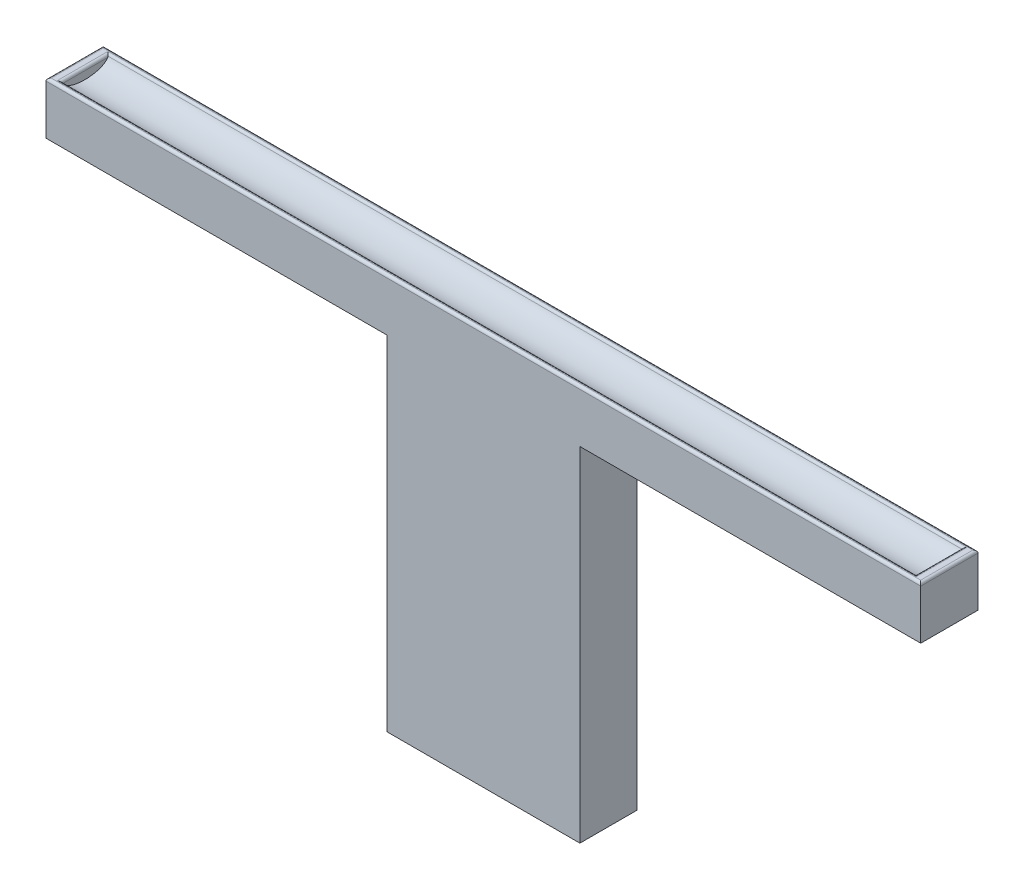
ISO-10303-21;
HEADER;
FILE_DESCRIPTION(('STEP AP214'),'2;1');
FILE_NAME('part.step','',(''),(''),'','','');
FILE_SCHEMA(('AUTOMOTIVE_DESIGN { 1 0 10303 214 1 1 1 1 }'));
ENDSEC;
DATA;
#1=APPLICATION_CONTEXT('core data for automotive mechanical design processes');
#2=APPLICATION_PROTOCOL_DEFINITION('international standard','automotive_design',2000,#1);
#3=PRODUCT_CONTEXT('',#1,'mechanical');
#4=PRODUCT('Part','Part','',(#3));
#5=PRODUCT_RELATED_PRODUCT_CATEGORY('part','',(#4));
#6=PRODUCT_DEFINITION_FORMATION('','',#4);
#7=PRODUCT_DEFINITION_CONTEXT('part definition',#1,'design');
#8=PRODUCT_DEFINITION('design','',#6,#7);
#9=PRODUCT_DEFINITION_SHAPE('','',#8);
#10=(LENGTH_UNIT() NAMED_UNIT(*) SI_UNIT(.MILLI.,.METRE.));
#11=(NAMED_UNIT(*) PLANE_ANGLE_UNIT() SI_UNIT($,.RADIAN.));
#12=(NAMED_UNIT(*) SI_UNIT($,.STERADIAN.) SOLID_ANGLE_UNIT());
#13=UNCERTAINTY_MEASURE_WITH_UNIT(LENGTH_MEASURE(1.E-05),#10,'distance_accuracy_value','');
#14=(GEOMETRIC_REPRESENTATION_CONTEXT(3) GLOBAL_UNCERTAINTY_ASSIGNED_CONTEXT((#13)) GLOBAL_UNIT_ASSIGNED_CONTEXT((#10,
#11,#12)) REPRESENTATION_CONTEXT('',''));
#15=CARTESIAN_POINT('',(0.,0.,0.));
#16=DIRECTION('',(0.,0.,1.));
#17=DIRECTION('',(1.,0.,0.));
#18=AXIS2_PLACEMENT_3D('',#15,#16,#17);
#19=CARTESIAN_POINT('',(79.7,39.5,-23.4991651044926));
#20=DIRECTION('',(-1.,0.,0.));
#21=DIRECTION('',(0.,0.,1.));
#22=AXIS2_PLACEMENT_3D('',#19,#20,#21);
#23=CYLINDRICAL_SURFACE('',#22,0.5);
#24=CARTESIAN_POINT('',(-42.370698613628,39.4999999999998,-23.4991651044926));
#25=DIRECTION('',(-0.707106781186547,0.,0.707106781186548));
#26=DIRECTION('',(-0.707106781186548,0.,-0.707106781186547));
#27=AXIS2_PLACEMENT_3D('',#24,#25,#26);
#28=ELLIPSE('',#27,0.707106781186547,0.5);
#29=CARTESIAN_POINT('',(-41.9020049228756,39.6741442627503,-23.0304714137402));
#30=VERTEX_POINT('',#29);
#31=CARTESIAN_POINT('',(-42.370698613628,39.9999999999999,-23.4991651044926));
#32=VERTEX_POINT('',#31);
#33=EDGE_CURVE('E288',#30,#32,#28,.T.);
#34=ORIENTED_EDGE('',*,*,#33,.F.);
#35=DIRECTION('',(-1.,0.,0.));
#36=VECTOR('',#35,1.);
#37=CARTESIAN_POINT('',(122.169301386372,39.6741442627503,-23.0304714137402));
#38=LINE('',#37,#36);
#39=CARTESIAN_POINT('',(122.20060769562,39.6741442627503,-23.0304714137402));
#40=VERTEX_POINT('',#39);
#41=EDGE_CURVE('E317',#40,#30,#38,.T.);
#42=ORIENTED_EDGE('',*,*,#41,.F.);
#43=CARTESIAN_POINT('',(122.669301386372,39.4999999999999,-23.4991651044926));
#44=DIRECTION('',(-0.707106781186548,0.,-0.707106781186547));
#45=DIRECTION('',(-0.707106781186547,0.,0.707106781186548));
#46=AXIS2_PLACEMENT_3D('',#43,#44,#45);
#47=ELLIPSE('',#46,0.707106781186548,0.5);
#48=CARTESIAN_POINT('',(122.669301386372,39.9999999999999,-23.4991651044926));
#49=VERTEX_POINT('',#48);
#50=EDGE_CURVE('E283',#40,#49,#47,.T.);
#51=ORIENTED_EDGE('',*,*,#50,.T.);
#52=DIRECTION('',(1.,0.,0.));
#53=VECTOR('',#52,1.);
#54=CARTESIAN_POINT('',(113.529301386372,39.9999999999999,-23.4991651044926));
#55=LINE('',#54,#53);
#56=EDGE_CURVE('E320',#32,#49,#55,.T.);
#57=ORIENTED_EDGE('',*,*,#56,.F.);
#58=EDGE_LOOP('',(#34,#42,#51,#57));
#59=FACE_BOUND('',#58,.T.);
#60=ADVANCED_FACE('F149',(#59),#23,.T.);
#61=CARTESIAN_POINT('',(79.7,39.5,-13.6820358754082));
#62=DIRECTION('',(-1.,0.,0.));
#63=DIRECTION('',(0.,0.,1.));
#64=AXIS2_PLACEMENT_3D('',#61,#62,#63);
#65=CYLINDRICAL_SURFACE('',#64,0.5);
#66=CARTESIAN_POINT('',(-42.370698613628,39.4999999999999,-13.6820358754082));
#67=DIRECTION('',(-0.707106781186548,0.,-0.707106781186547));
#68=DIRECTION('',(0.707106781186547,0.,-0.707106781186548));
#69=AXIS2_PLACEMENT_3D('',#66,#67,#68);
#70=ELLIPSE('',#69,0.707106781186547,0.5);
#71=CARTESIAN_POINT('',(-42.370698613628,39.9999999999999,-13.6820358754082));
#72=VERTEX_POINT('',#71);
#73=CARTESIAN_POINT('',(-41.9020049228756,39.6741442627503,-14.1507295661606));
#74=VERTEX_POINT('',#73);
#75=EDGE_CURVE('E291',#72,#74,#70,.T.);
#76=ORIENTED_EDGE('',*,*,#75,.F.);
#77=DIRECTION('',(-1.,0.,0.));
#78=VECTOR('',#77,1.);
#79=CARTESIAN_POINT('',(-33.230698613628,39.9999999999999,-13.6820358754082));
#80=LINE('',#79,#78);
#81=CARTESIAN_POINT('',(122.669301386372,39.9999999999999,-13.6820358754082));
#82=VERTEX_POINT('',#81);
#83=EDGE_CURVE('E380',#82,#72,#80,.T.);
#84=ORIENTED_EDGE('',*,*,#83,.F.);
#85=CARTESIAN_POINT('',(122.669301386372,39.4999999999999,-13.6820358754082));
#86=DIRECTION('',(-0.707106781186547,0.,0.707106781186548));
#87=DIRECTION('',(-0.707106781186548,0.,-0.707106781186547));
#88=AXIS2_PLACEMENT_3D('',#85,#86,#87);
#89=ELLIPSE('',#88,0.707106781186547,0.5);
#90=CARTESIAN_POINT('',(122.20060769562,39.6741442627504,-14.1507295661606));
#91=VERTEX_POINT('',#90);
#92=EDGE_CURVE('E272',#82,#91,#89,.T.);
#93=ORIENTED_EDGE('',*,*,#92,.T.);
#94=DIRECTION('',(1.,0.,0.));
#95=VECTOR('',#94,1.);
#96=CARTESIAN_POINT('',(-41.870698613628,39.6741442627503,-14.1507295661606));
#97=LINE('',#96,#95);
#98=EDGE_CURVE('E771',#74,#91,#97,.T.);
#99=ORIENTED_EDGE('',*,*,#98,.F.);
#100=EDGE_LOOP('',(#76,#84,#93,#99));
#101=FACE_BOUND('',#100,.T.);
#102=ADVANCED_FACE('F529',(#101),#65,.T.);
#103=CARTESIAN_POINT('',(0.,39.5,-23.5906004899504));
#104=DIRECTION('',(1.,0.,0.));
#105=DIRECTION('',(0.,0.,-1.));
#106=AXIS2_PLACEMENT_3D('',#103,#104,#105);
#107=CYLINDRICAL_SURFACE('',#106,0.5);
#108=CARTESIAN_POINT('',(-43.370698613628,39.4999999999999,-23.5906004899504));
#109=DIRECTION('',(0.707106781186547,0.,-0.707106781186548));
#110=DIRECTION('',(-0.707106781186548,0.,-0.707106781186547));
#111=AXIS2_PLACEMENT_3D('',#108,#109,#110);
#112=ELLIPSE('',#111,0.707106781186548,0.5);
#113=CARTESIAN_POINT('',(-43.870698613628,39.4999999999999,-24.0906004899504));
#114=VERTEX_POINT('',#113);
#115=CARTESIAN_POINT('',(-43.370698613628,39.9999999999999,-23.5906004899504));
#116=VERTEX_POINT('',#115);
#117=EDGE_CURVE('E275',#114,#116,#112,.T.);
#118=ORIENTED_EDGE('',*,*,#117,.T.);
#119=DIRECTION('',(-1.,0.,0.));
#120=VECTOR('',#119,1.);
#121=CARTESIAN_POINT('',(-35.230698613628,39.9999999999999,-23.5906004899504));
#122=LINE('',#121,#120);
#123=CARTESIAN_POINT('',(123.669301386372,39.9999999999999,-23.5906004899504));
#124=VERTEX_POINT('',#123);
#125=EDGE_CURVE('E379',#124,#116,#122,.T.);
#126=ORIENTED_EDGE('',*,*,#125,.F.);
#127=CARTESIAN_POINT('',(123.669301386372,39.4999999999999,-23.5906004899504));
#128=DIRECTION('',(-0.707106781186547,0.,-0.707106781186547));
#129=DIRECTION('',(-0.707106781186547,0.,0.707106781186547));
#130=AXIS2_PLACEMENT_3D('',#127,#128,#129);
#131=ELLIPSE('',#130,0.707106781186547,0.5);
#132=CARTESIAN_POINT('',(124.169301386372,39.4999999999999,-24.0906004899504));
#133=VERTEX_POINT('',#132);
#134=EDGE_CURVE('E267',#124,#133,#131,.T.);
#135=ORIENTED_EDGE('',*,*,#134,.T.);
#136=DIRECTION('',(1.,0.,0.));
#137=VECTOR('',#136,1.);
#138=CARTESIAN_POINT('',(115.529301386372,39.4999999999999,-24.0906004899504));
#139=LINE('',#138,#137);
#140=EDGE_CURVE('E396',#114,#133,#139,.T.);
#141=ORIENTED_EDGE('',*,*,#140,.F.);
#142=EDGE_LOOP('',(#118,#126,#135,#141));
#143=FACE_BOUND('',#142,.T.);
#144=ADVANCED_FACE('F534',(#143),#107,.T.);
#145=CARTESIAN_POINT('',(0.,39.5,-13.5906004899504));
#146=DIRECTION('',(-1.,0.,0.));
#147=DIRECTION('',(0.,0.,1.));
#148=AXIS2_PLACEMENT_3D('',#145,#146,#147);
#149=CYLINDRICAL_SURFACE('',#148,0.5);
#150=CARTESIAN_POINT('',(-43.370698613628,39.4999999999999,-13.5906004899504));
#151=DIRECTION('',(-0.707106781186548,0.,-0.707106781186547));
#152=DIRECTION('',(0.707106781186547,0.,-0.707106781186548));
#153=AXIS2_PLACEMENT_3D('',#150,#151,#152);
#154=ELLIPSE('',#153,0.707106781186547,0.5);
#155=CARTESIAN_POINT('',(-43.870698613628,39.4999999999999,-13.0906004899504));
#156=VERTEX_POINT('',#155);
#157=CARTESIAN_POINT('',(-43.370698613628,39.9999999999999,-13.5906004899504));
#158=VERTEX_POINT('',#157);
#159=EDGE_CURVE('E262',#156,#158,#154,.T.);
#160=ORIENTED_EDGE('',*,*,#159,.F.);
#161=DIRECTION('',(-1.,0.,0.));
#162=VECTOR('',#161,1.);
#163=CARTESIAN_POINT('',(-35.230698613628,39.4999999999999,-13.0906004899504));
#164=LINE('',#163,#162);
#165=CARTESIAN_POINT('',(124.169301386372,39.4999999999999,-13.0906004899504));
#166=VERTEX_POINT('',#165);
#167=EDGE_CURVE('E223',#166,#156,#164,.T.);
#168=ORIENTED_EDGE('',*,*,#167,.F.);
#169=CARTESIAN_POINT('',(123.669301386372,39.4999999999999,-13.5906004899504));
#170=DIRECTION('',(0.707106781186547,0.,-0.707106781186547));
#171=DIRECTION('',(-0.707106781186547,0.,-0.707106781186547));
#172=AXIS2_PLACEMENT_3D('',#169,#170,#171);
#173=ELLIPSE('',#172,0.707106781186547,0.5);
#174=CARTESIAN_POINT('',(123.669301386372,39.9999999999999,-13.5906004899504));
#175=VERTEX_POINT('',#174);
#176=EDGE_CURVE('E259',#175,#166,#173,.T.);
#177=ORIENTED_EDGE('',*,*,#176,.F.);
#178=DIRECTION('',(1.,0.,0.));
#179=VECTOR('',#178,1.);
#180=CARTESIAN_POINT('',(115.529301386372,39.9999999999999,-13.5906004899504));
#181=LINE('',#180,#179);
#182=EDGE_CURVE('E278',#158,#175,#181,.T.);
#183=ORIENTED_EDGE('',*,*,#182,.F.);
#184=EDGE_LOOP('',(#160,#168,#177,#183));
#185=FACE_BOUND('',#184,.T.);
#186=ADVANCED_FACE('F506',(#185),#149,.T.);
#187=CARTESIAN_POINT('',(0.,40.,0.));
#188=DIRECTION('',(0.,1.,0.));
#189=DIRECTION('',(0.,0.,1.));
#190=AXIS2_PLACEMENT_3D('',#187,#188,#189);
#191=PLANE('',#190);
#192=ORIENTED_EDGE('',*,*,#125,.T.);
#193=DIRECTION('',(0.,0.,1.));
#194=VECTOR('',#193,1.);
#195=CARTESIAN_POINT('',(-43.370698613628,39.9999999999999,-13.0906004899504));
#196=LINE('',#195,#194);
#197=EDGE_CURVE('E373',#116,#158,#196,.T.);
#198=ORIENTED_EDGE('',*,*,#197,.T.);
#199=ORIENTED_EDGE('',*,*,#182,.T.);
#200=DIRECTION('',(0.,0.,-1.));
#201=VECTOR('',#200,1.);
#202=CARTESIAN_POINT('',(123.669301386372,39.9999999999999,-24.0906004899504));
#203=LINE('',#202,#201);
#204=EDGE_CURVE('E382',#175,#124,#203,.T.);
#205=ORIENTED_EDGE('',*,*,#204,.T.);
#206=EDGE_LOOP('',(#192,#198,#199,#205));
#207=FACE_BOUND('',#206,.T.);
#208=ORIENTED_EDGE('',*,*,#56,.T.);
#209=DIRECTION('',(0.,0.,1.));
#210=VECTOR('',#209,1.);
#211=CARTESIAN_POINT('',(122.669301386372,39.9999999999999,0.));
#212=LINE('',#211,#210);
#213=EDGE_CURVE('E371',#49,#82,#212,.T.);
#214=ORIENTED_EDGE('',*,*,#213,.T.);
#215=ORIENTED_EDGE('',*,*,#83,.T.);
#216=DIRECTION('',(0.,0.,-1.));
#217=VECTOR('',#216,1.);
#218=CARTESIAN_POINT('',(-42.370698613628,39.9999999999999,0.));
#219=LINE('',#218,#217);
#220=EDGE_CURVE('E306',#72,#32,#219,.T.);
#221=ORIENTED_EDGE('',*,*,#220,.T.);
#222=EDGE_LOOP('',(#208,#214,#215,#221));
#223=FACE_BOUND('',#222,.T.);
#224=ADVANCED_FACE('F370',(#207,#223),#191,.T.);
#225=CARTESIAN_POINT('',(124.169301386372,29.9999999999999,-9.0906004899504));
#226=DIRECTION('',(0.,1.,0.));
#227=DIRECTION('',(0.,0.,1.));
#228=AXIS2_PLACEMENT_3D('',#225,#226,#227);
#229=PLANE('',#228);
#230=DIRECTION('',(0.,0.,-1.));
#231=VECTOR('',#230,1.);
#232=CARTESIAN_POINT('',(21.6091454849036,29.9999999999999,-13.0906004899504));
#233=LINE('',#232,#231);
#234=CARTESIAN_POINT('',(21.6091454849036,29.9999999999999,-13.0906004899504));
#235=VERTEX_POINT('',#234);
#236=CARTESIAN_POINT('',(21.6091454849036,29.9999999999999,-24.0906004899504));
#237=VERTEX_POINT('',#236);
#238=EDGE_CURVE('E222',#235,#237,#233,.T.);
#239=ORIENTED_EDGE('',*,*,#238,.F.);
#240=DIRECTION('',(1.,0.,0.));
#241=VECTOR('',#240,1.);
#242=CARTESIAN_POINT('',(107.929301386372,29.9999999999998,-13.0906004899504));
#243=LINE('',#242,#241);
#244=CARTESIAN_POINT('',(-43.870698613628,29.9999999999998,-13.0906004899504));
#245=VERTEX_POINT('',#244);
#246=EDGE_CURVE('E242',#245,#235,#243,.T.);
#247=ORIENTED_EDGE('',*,*,#246,.F.);
#248=DIRECTION('',(0.,0.,-1.));
#249=VECTOR('',#248,1.);
#250=CARTESIAN_POINT('',(-43.870698613628,29.9999999999998,0.));
#251=LINE('',#250,#249);
#252=CARTESIAN_POINT('',(-43.870698613628,29.9999999999998,-24.0906004899504));
#253=VERTEX_POINT('',#252);
#254=EDGE_CURVE('E424',#245,#253,#251,.T.);
#255=ORIENTED_EDGE('',*,*,#254,.T.);
#256=DIRECTION('',(1.,0.,0.));
#257=VECTOR('',#256,1.);
#258=CARTESIAN_POINT('',(115.529301386372,29.9999999999998,-24.0906004899504));
#259=LINE('',#258,#257);
#260=EDGE_CURVE('E168',#253,#237,#259,.T.);
#261=ORIENTED_EDGE('',*,*,#260,.T.);
#262=EDGE_LOOP('',(#239,#247,#255,#261));
#263=FACE_BOUND('',#262,.T.);
#264=ADVANCED_FACE('F519',(#263),#229,.F.);
#265=CARTESIAN_POINT('',(-35.230698613628,39.9999999999999,-24.0906004899504));
#266=DIRECTION('',(0.,0.,1.));
#267=DIRECTION('',(1.,0.,0.));
#268=AXIS2_PLACEMENT_3D('',#265,#266,#267);
#269=PLANE('',#268);
#270=DIRECTION('',(0.,1.,0.));
#271=VECTOR('',#270,1.);
#272=CARTESIAN_POINT('',(21.6091454849036,-36.0000000000001,-24.0906004899504));
#273=LINE('',#272,#271);
#274=CARTESIAN_POINT('',(21.6091454849036,-36.0000000000001,-24.0906004899504));
#275=VERTEX_POINT('',#274);
#276=EDGE_CURVE('E159',#275,#237,#273,.T.);
#277=ORIENTED_EDGE('',*,*,#276,.T.);
#278=ORIENTED_EDGE('',*,*,#260,.F.);
#279=DIRECTION('',(0.,-1.,0.));
#280=VECTOR('',#279,1.);
#281=CARTESIAN_POINT('',(-43.870698613628,39.9999999999999,-24.0906004899504));
#282=LINE('',#281,#280);
#283=EDGE_CURVE('E407',#114,#253,#282,.T.);
#284=ORIENTED_EDGE('',*,*,#283,.F.);
#285=ORIENTED_EDGE('',*,*,#140,.T.);
#286=DIRECTION('',(0.,-1.,0.));
#287=VECTOR('',#286,1.);
#288=CARTESIAN_POINT('',(124.169301386372,39.9999999999999,-24.0906004899504));
#289=LINE('',#288,#287);
#290=CARTESIAN_POINT('',(124.169301386372,29.9999999999999,-24.0906004899504));
#291=VERTEX_POINT('',#290);
#292=EDGE_CURVE('E13',#133,#291,#289,.T.);
#293=ORIENTED_EDGE('',*,*,#292,.T.);
#294=DIRECTION('',(1.,0.,0.));
#295=VECTOR('',#294,1.);
#296=CARTESIAN_POINT('',(124.169301386372,29.9999999999999,-24.0906004899504));
#297=LINE('',#296,#295);
#298=CARTESIAN_POINT('',(58.6933230504978,29.9999999999999,-24.0906004899504));
#299=VERTEX_POINT('',#298);
#300=EDGE_CURVE('E425',#299,#291,#297,.T.);
#301=ORIENTED_EDGE('',*,*,#300,.F.);
#302=DIRECTION('',(0.,1.,0.));
#303=VECTOR('',#302,1.);
#304=CARTESIAN_POINT('',(58.6933230504978,-36.0000000000001,-24.0906004899504));
#305=LINE('',#304,#303);
#306=CARTESIAN_POINT('',(58.6933230504978,-36.0000000000001,-24.0906004899504));
#307=VERTEX_POINT('',#306);
#308=EDGE_CURVE('E211',#307,#299,#305,.T.);
#309=ORIENTED_EDGE('',*,*,#308,.F.);
#310=DIRECTION('',(1.,0.,0.));
#311=VECTOR('',#310,1.);
#312=CARTESIAN_POINT('',(21.6091454849036,-36.0000000000001,-24.0906004899504));
#313=LINE('',#312,#311);
#314=EDGE_CURVE('E205',#275,#307,#313,.T.);
#315=ORIENTED_EDGE('',*,*,#314,.F.);
#316=EDGE_LOOP('',(#277,#278,#284,#285,#293,#301,#309,#315));
#317=FACE_BOUND('',#316,.T.);
#318=ADVANCED_FACE('F207',(#317),#269,.F.);
#319=CARTESIAN_POINT('',(116.569301386372,39.9999999999999,-13.0906004899504));
#320=DIRECTION('',(0.,0.,-1.));
#321=DIRECTION('',(-1.,0.,0.));
#322=AXIS2_PLACEMENT_3D('',#319,#320,#321);
#323=PLANE('',#322);
#324=ORIENTED_EDGE('',*,*,#167,.T.);
#325=DIRECTION('',(0.,-1.,0.));
#326=VECTOR('',#325,1.);
#327=CARTESIAN_POINT('',(-43.870698613628,39.9999999999999,-13.0906004899504));
#328=LINE('',#327,#326);
#329=EDGE_CURVE('E393',#156,#245,#328,.T.);
#330=ORIENTED_EDGE('',*,*,#329,.T.);
#331=ORIENTED_EDGE('',*,*,#246,.T.);
#332=DIRECTION('',(0.,1.,0.));
#333=VECTOR('',#332,1.);
#334=CARTESIAN_POINT('',(21.6091454849036,-36.0000000000001,-13.0906004899504));
#335=LINE('',#334,#333);
#336=CARTESIAN_POINT('',(21.6091454849036,-36.0000000000001,-13.0906004899504));
#337=VERTEX_POINT('',#336);
#338=EDGE_CURVE('E238',#337,#235,#335,.T.);
#339=ORIENTED_EDGE('',*,*,#338,.F.);
#340=DIRECTION('',(-1.,0.,0.));
#341=VECTOR('',#340,1.);
#342=CARTESIAN_POINT('',(21.6091454849036,-36.0000000000001,-13.0906004899504));
#343=LINE('',#342,#341);
#344=CARTESIAN_POINT('',(58.6933230504978,-36.0000000000001,-13.0906004899504));
#345=VERTEX_POINT('',#344);
#346=EDGE_CURVE('E226',#345,#337,#343,.T.);
#347=ORIENTED_EDGE('',*,*,#346,.F.);
#348=DIRECTION('',(0.,1.,0.));
#349=VECTOR('',#348,1.);
#350=CARTESIAN_POINT('',(58.6933230504978,-36.0000000000001,-13.0906004899504));
#351=LINE('',#350,#349);
#352=CARTESIAN_POINT('',(58.6933230504978,29.9999999999999,-13.0906004899504));
#353=VERTEX_POINT('',#352);
#354=EDGE_CURVE('E417',#345,#353,#351,.T.);
#355=ORIENTED_EDGE('',*,*,#354,.T.);
#356=DIRECTION('',(1.,0.,0.));
#357=VECTOR('',#356,1.);
#358=CARTESIAN_POINT('',(116.569301386372,29.9999999999999,-13.0906004899504));
#359=LINE('',#358,#357);
#360=CARTESIAN_POINT('',(124.169301386372,29.9999999999999,-13.0906004899504));
#361=VERTEX_POINT('',#360);
#362=EDGE_CURVE('E414',#353,#361,#359,.T.);
#363=ORIENTED_EDGE('',*,*,#362,.T.);
#364=DIRECTION('',(0.,-1.,0.));
#365=VECTOR('',#364,1.);
#366=CARTESIAN_POINT('',(124.169301386372,39.9999999999999,-13.0906004899504));
#367=LINE('',#366,#365);
#368=EDGE_CURVE('E399',#166,#361,#367,.T.);
#369=ORIENTED_EDGE('',*,*,#368,.F.);
#370=EDGE_LOOP('',(#324,#330,#331,#339,#347,#355,#363,#369));
#371=FACE_BOUND('',#370,.T.);
#372=ADVANCED_FACE('F456',(#371),#323,.F.);
#373=CARTESIAN_POINT('',(134.018159188168,39.9999999999999,-18.5906004899504));
#374=DIRECTION('',(-1.,0.,0.));
#375=DIRECTION('',(0.,0.,1.));
#376=AXIS2_PLACEMENT_3D('',#373,#374,#375);
#377=ELLIPSE('',#376,4.5,2.);
#378=DIRECTION('',(-1.,0.,0.));
#379=VECTOR('',#378,1.);
#380=SURFACE_OF_LINEAR_EXTRUSION('',#377,#379);
#381=ORIENTED_EDGE('',*,*,#41,.T.);
#382=CARTESIAN_POINT('',(-41.9020049228756,39.6741442627503,-23.0304714137402));
#383=CARTESIAN_POINT('',(-41.898389196127,39.6644148707311,-23.0268576576833));
#384=CARTESIAN_POINT('',(-41.8951010155036,39.6546351901778,-23.0230565023231));
#385=CARTESIAN_POINT('',(-41.8891909730622,39.6351053359472,-23.01512636861));
#386=CARTESIAN_POINT('',(-41.8865640049845,39.6253555492551,-23.0110002473491));
#387=CARTESIAN_POINT('',(-41.8819389554278,39.605894848501,-23.0024249293393));
#388=CARTESIAN_POINT('',(-41.8799385772576,39.596183924401,-22.997976987807));
#389=CARTESIAN_POINT('',(-41.8765360626027,39.5768117312066,-22.9887661707618));
#390=CARTESIAN_POINT('',(-41.8751337041088,39.5671504450028,-22.9840034128813));
#391=CARTESIAN_POINT('',(-41.8729007146377,39.5478727373782,-22.9741635103287));
#392=CARTESIAN_POINT('',(-41.8720724489043,39.5382566617961,-22.9690851578717));
#393=CARTESIAN_POINT('',(-41.8709691956277,39.5190681689827,-22.9586167168078));
#394=CARTESIAN_POINT('',(-41.8706984510529,39.5094966356994,-22.9532245563896));
#395=CARTESIAN_POINT('',(-41.870698613628,39.4999999999998,-22.9477067544337));
#396=B_SPLINE_CURVE_WITH_KNOTS('',3,(#382,#383,#384,#385,#386,#387,#388,#389,#390,#391,#392,
#393,#394,#395),.UNSPECIFIED.,.F.,.F.,(4,2,2,2,2,2,4),(0.,0.032962943611274,0.0656629273291335,
0.0982416112863772,0.130808190151781,0.163508157262706,0.196456078578821),.UNSPECIFIED.);
#397=CARTESIAN_POINT('',(-41.870698613628,39.4999999999999,-22.9477067544337));
#398=VERTEX_POINT('',#397);
#399=EDGE_CURVE('E311',#30,#398,#396,.T.);
#400=ORIENTED_EDGE('',*,*,#399,.T.);
#401=CARTESIAN_POINT('',(-41.870698613628,39.9999999999999,-18.5906004899504));
#402=DIRECTION('',(1.,0.,0.));
#403=DIRECTION('',(0.,0.,1.));
#404=AXIS2_PLACEMENT_3D('',#401,#402,#403);
#405=ELLIPSE('',#404,4.5,2.);
#406=CARTESIAN_POINT('',(-41.870698613628,39.4999999999999,-14.2334942254671));
#407=VERTEX_POINT('',#406);
#408=EDGE_CURVE('E252',#407,#398,#405,.T.);
#409=ORIENTED_EDGE('',*,*,#408,.F.);
#410=CARTESIAN_POINT('',(-41.870698613628,39.4999999999999,-14.2334942254671));
#411=CARTESIAN_POINT('',(-41.8706984510529,39.5094966356994,-14.2279764235112));
#412=CARTESIAN_POINT('',(-41.8709691956277,39.5190681689827,-14.222584263093));
#413=CARTESIAN_POINT('',(-41.8720724489043,39.5382566617961,-14.2121158220291));
#414=CARTESIAN_POINT('',(-41.8729007146377,39.5478727373782,-14.2070374695722));
#415=CARTESIAN_POINT('',(-41.8751337041088,39.5671504450028,-14.1971975670195));
#416=CARTESIAN_POINT('',(-41.8765360626027,39.5768117312066,-14.192434809139));
#417=CARTESIAN_POINT('',(-41.8799385772576,39.596183924401,-14.1832239920938));
#418=CARTESIAN_POINT('',(-41.8819389554278,39.605894848501,-14.1787760505615));
#419=CARTESIAN_POINT('',(-41.8865640049845,39.6253555492551,-14.1702007325518));
#420=CARTESIAN_POINT('',(-41.8891909730622,39.6351053359472,-14.1660746112908));
#421=CARTESIAN_POINT('',(-41.8951010155036,39.6546351901778,-14.1581444775777));
#422=CARTESIAN_POINT('',(-41.898389196127,39.6644148707311,-14.1543433222175));
#423=CARTESIAN_POINT('',(-41.9020049228756,39.6741442627503,-14.1507295661606));
#424=B_SPLINE_CURVE_WITH_KNOTS('',3,(#410,#411,#412,#413,#414,#415,#416,#417,#418,#419,#420,
#421,#422,#423),.UNSPECIFIED.,.F.,.F.,(4,2,2,2,2,2,4),(0.,0.0329479213161085,0.0656478884270374,
0.0982144672924417,0.13079315124968,0.163493134967548,0.19645607857882),.UNSPECIFIED.);
#425=EDGE_CURVE('E769',#407,#74,#424,.T.);
#426=ORIENTED_EDGE('',*,*,#425,.T.);
#427=ORIENTED_EDGE('',*,*,#98,.T.);
#428=CARTESIAN_POINT('',(122.20060769562,39.6741442627504,-14.1507295661606));
#429=CARTESIAN_POINT('',(122.196991968871,39.6644148707311,-14.1543433222175));
#430=CARTESIAN_POINT('',(122.193703788247,39.6546351901778,-14.1581444775777));
#431=CARTESIAN_POINT('',(122.187793745806,39.6351053359473,-14.1660746112908));
#432=CARTESIAN_POINT('',(122.185166777728,39.6253555492551,-14.1702007325518));
#433=CARTESIAN_POINT('',(122.180541728172,39.605894848501,-14.1787760505616));
#434=CARTESIAN_POINT('',(122.178541350001,39.596183924401,-14.1832239920938));
#435=CARTESIAN_POINT('',(122.175138835347,39.5768117312067,-14.192434809139));
#436=CARTESIAN_POINT('',(122.173736476853,39.5671504450029,-14.1971975670195));
#437=CARTESIAN_POINT('',(122.171503487382,39.5478727373783,-14.2070374695722));
#438=CARTESIAN_POINT('',(122.170675221648,39.5382566617961,-14.2121158220291));
#439=CARTESIAN_POINT('',(122.169571968372,39.5190681689827,-14.222584263093));
#440=CARTESIAN_POINT('',(122.169301223797,39.5094966356994,-14.2279764235112));
#441=CARTESIAN_POINT('',(122.169301386372,39.4999999999999,-14.2334942254671));
#442=B_SPLINE_CURVE_WITH_KNOTS('',3,(#428,#429,#430,#431,#432,#433,#434,#435,#436,#437,#438,
#439,#440,#441),.UNSPECIFIED.,.F.,.F.,(4,2,2,2,2,2,4),(0.,0.032962943611279,0.0656629273291387,
0.0982416112863693,0.130808190151781,0.163508157262703,0.196456078578819),.UNSPECIFIED.);
#443=CARTESIAN_POINT('',(122.169301386372,39.4999999999999,-14.2334942254671));
#444=VERTEX_POINT('',#443);
#445=EDGE_CURVE('E248',#91,#444,#442,.T.);
#446=ORIENTED_EDGE('',*,*,#445,.T.);
#447=CARTESIAN_POINT('',(122.169301386372,39.9999999999999,-18.5906004899504));
#448=DIRECTION('',(1.,0.,0.));
#449=DIRECTION('',(0.,0.,1.));
#450=AXIS2_PLACEMENT_3D('',#447,#448,#449);
#451=ELLIPSE('',#450,4.5,2.);
#452=CARTESIAN_POINT('',(122.169301386372,39.4999999999999,-22.9477067544338));
#453=VERTEX_POINT('',#452);
#454=EDGE_CURVE('E245',#444,#453,#451,.T.);
#455=ORIENTED_EDGE('',*,*,#454,.T.);
#456=CARTESIAN_POINT('',(122.169301386372,39.4999999999999,-22.9477067544338));
#457=CARTESIAN_POINT('',(122.169301223797,39.5094966356994,-22.9532245563896));
#458=CARTESIAN_POINT('',(122.169571968372,39.5190681689827,-22.9586167168078));
#459=CARTESIAN_POINT('',(122.170675221648,39.5382566617961,-22.9690851578717));
#460=CARTESIAN_POINT('',(122.171503487382,39.5478727373783,-22.9741635103287));
#461=CARTESIAN_POINT('',(122.173736476853,39.5671504450029,-22.9840034128814));
#462=CARTESIAN_POINT('',(122.175138835347,39.5768117312067,-22.9887661707619));
#463=CARTESIAN_POINT('',(122.178541350001,39.596183924401,-22.9979769878071));
#464=CARTESIAN_POINT('',(122.180541728172,39.605894848501,-23.0024249293393));
#465=CARTESIAN_POINT('',(122.185166777728,39.6253555492551,-23.0110002473491));
#466=CARTESIAN_POINT('',(122.187793745806,39.6351053359473,-23.01512636861));
#467=CARTESIAN_POINT('',(122.193703788247,39.6546351901778,-23.0230565023232));
#468=CARTESIAN_POINT('',(122.196991968871,39.6644148707311,-23.0268576576834));
#469=CARTESIAN_POINT('',(122.20060769562,39.6741442627503,-23.0304714137402));
#470=B_SPLINE_CURVE_WITH_KNOTS('',3,(#456,#457,#458,#459,#460,#461,#462,#463,#464,#465,#466,
#467,#468,#469),.UNSPECIFIED.,.F.,.F.,(4,2,2,2,2,2,4),(0.,0.0329479213161076,0.0656478884270366,
0.098214467292434,0.130793151249672,0.163493134967531,0.196456078578803),.UNSPECIFIED.);
#471=EDGE_CURVE('E249',#453,#40,#470,.T.);
#472=ORIENTED_EDGE('',*,*,#471,.T.);
#473=EDGE_LOOP('',(#381,#400,#409,#426,#427,#446,#455,#472));
#474=FACE_BOUND('',#473,.T.);
#475=ADVANCED_FACE('F614',(#474),#380,.F.);
#476=CARTESIAN_POINT('',(124.169301386372,29.9999999999999,-9.0906004899504));
#477=DIRECTION('',(0.,1.,0.));
#478=DIRECTION('',(0.,0.,1.));
#479=AXIS2_PLACEMENT_3D('',#476,#477,#478);
#480=PLANE('',#479);
#481=DIRECTION('',(0.,0.,1.));
#482=VECTOR('',#481,1.);
#483=CARTESIAN_POINT('',(58.6933230504978,29.9999999999999,-13.0906004899504));
#484=LINE('',#483,#482);
#485=EDGE_CURVE('E229',#299,#353,#484,.T.);
#486=ORIENTED_EDGE('',*,*,#485,.F.);
#487=ORIENTED_EDGE('',*,*,#300,.T.);
#488=DIRECTION('',(0.,0.,-1.));
#489=VECTOR('',#488,1.);
#490=CARTESIAN_POINT('',(124.169301386372,29.9999999999999,-9.0906004899504));
#491=LINE('',#490,#489);
#492=EDGE_CURVE('E402',#361,#291,#491,.T.);
#493=ORIENTED_EDGE('',*,*,#492,.F.);
#494=ORIENTED_EDGE('',*,*,#362,.F.);
#495=EDGE_LOOP('',(#486,#487,#493,#494));
#496=FACE_BOUND('',#495,.T.);
#497=ADVANCED_FACE('F460',(#496),#480,.F.);
#498=CARTESIAN_POINT('',(-43.870698613628,39.9999999999999,-24.0906004899504));
#499=DIRECTION('',(1.,0.,0.));
#500=DIRECTION('',(0.,0.,-1.));
#501=AXIS2_PLACEMENT_3D('',#498,#499,#500);
#502=PLANE('',#501);
#503=ORIENTED_EDGE('',*,*,#329,.F.);
#504=DIRECTION('',(0.,0.,-1.));
#505=VECTOR('',#504,1.);
#506=CARTESIAN_POINT('',(-43.870698613628,39.4999999999999,-24.0906004899504));
#507=LINE('',#506,#505);
#508=EDGE_CURVE('E384',#156,#114,#507,.T.);
#509=ORIENTED_EDGE('',*,*,#508,.T.);
#510=ORIENTED_EDGE('',*,*,#283,.T.);
#511=ORIENTED_EDGE('',*,*,#254,.F.);
#512=EDGE_LOOP('',(#503,#509,#510,#511));
#513=FACE_BOUND('',#512,.T.);
#514=ADVANCED_FACE('F518',(#513),#502,.F.);
#515=CARTESIAN_POINT('',(124.169301386372,39.9999999999999,-24.0906004899504));
#516=DIRECTION('',(-1.,0.,0.));
#517=DIRECTION('',(0.,0.,1.));
#518=AXIS2_PLACEMENT_3D('',#515,#516,#517);
#519=PLANE('',#518);
#520=ORIENTED_EDGE('',*,*,#292,.F.);
#521=DIRECTION('',(0.,0.,1.));
#522=VECTOR('',#521,1.);
#523=CARTESIAN_POINT('',(124.169301386372,39.4999999999999,-13.0906004899504));
#524=LINE('',#523,#522);
#525=EDGE_CURVE('E401',#133,#166,#524,.T.);
#526=ORIENTED_EDGE('',*,*,#525,.T.);
#527=ORIENTED_EDGE('',*,*,#368,.T.);
#528=ORIENTED_EDGE('',*,*,#492,.T.);
#529=EDGE_LOOP('',(#520,#526,#527,#528));
#530=FACE_BOUND('',#529,.T.);
#531=ADVANCED_FACE('F463',(#530),#519,.F.);
#532=CARTESIAN_POINT('',(21.6091454849036,-36.0000000000001,-13.0906004899504));
#533=DIRECTION('',(1.,0.,0.));
#534=DIRECTION('',(0.,0.,-1.));
#535=AXIS2_PLACEMENT_3D('',#532,#533,#534);
#536=PLANE('',#535);
#537=ORIENTED_EDGE('',*,*,#238,.T.);
#538=ORIENTED_EDGE('',*,*,#276,.F.);
#539=DIRECTION('',(0.,0.,-1.));
#540=VECTOR('',#539,1.);
#541=CARTESIAN_POINT('',(21.6091454849036,-36.0000000000001,-13.0906004899504));
#542=LINE('',#541,#540);
#543=EDGE_CURVE('E215',#337,#275,#542,.T.);
#544=ORIENTED_EDGE('',*,*,#543,.F.);
#545=ORIENTED_EDGE('',*,*,#338,.T.);
#546=EDGE_LOOP('',(#537,#538,#544,#545));
#547=FACE_BOUND('',#546,.T.);
#548=ADVANCED_FACE('F220',(#547),#536,.F.);
#549=CARTESIAN_POINT('',(58.6933230504978,-36.0000000000001,-13.0906004899504));
#550=DIRECTION('',(-1.,0.,0.));
#551=DIRECTION('',(0.,0.,1.));
#552=AXIS2_PLACEMENT_3D('',#549,#550,#551);
#553=PLANE('',#552);
#554=ORIENTED_EDGE('',*,*,#485,.T.);
#555=ORIENTED_EDGE('',*,*,#354,.F.);
#556=DIRECTION('',(0.,0.,1.));
#557=VECTOR('',#556,1.);
#558=CARTESIAN_POINT('',(58.6933230504978,-36.0000000000001,-13.0906004899504));
#559=LINE('',#558,#557);
#560=EDGE_CURVE('E216',#307,#345,#559,.T.);
#561=ORIENTED_EDGE('',*,*,#560,.F.);
#562=ORIENTED_EDGE('',*,*,#308,.T.);
#563=EDGE_LOOP('',(#554,#555,#561,#562));
#564=FACE_BOUND('',#563,.T.);
#565=ADVANCED_FACE('F453',(#564),#553,.F.);
#566=CARTESIAN_POINT('',(-35.230698613628,-36.0000000000001,0.));
#567=DIRECTION('',(0.,-1.,0.));
#568=DIRECTION('',(0.,0.,-1.));
#569=AXIS2_PLACEMENT_3D('',#566,#567,#568);
#570=PLANE('',#569);
#571=ORIENTED_EDGE('',*,*,#543,.T.);
#572=ORIENTED_EDGE('',*,*,#314,.T.);
#573=ORIENTED_EDGE('',*,*,#560,.T.);
#574=ORIENTED_EDGE('',*,*,#346,.T.);
#575=EDGE_LOOP('',(#571,#572,#573,#574));
#576=FACE_BOUND('',#575,.T.);
#577=ADVANCED_FACE('F225',(#576),#570,.T.);
#578=CARTESIAN_POINT('',(122.169301386372,39.9999999999999,-24.0906004899504));
#579=DIRECTION('',(-1.,0.,0.));
#580=DIRECTION('',(0.,0.,1.));
#581=AXIS2_PLACEMENT_3D('',#578,#579,#580);
#582=PLANE('',#581);
#583=ORIENTED_EDGE('',*,*,#454,.F.);
#584=DIRECTION('',(0.,0.,-1.));
#585=VECTOR('',#584,1.);
#586=CARTESIAN_POINT('',(122.169301386372,39.4999999999999,-24.0906004899504));
#587=LINE('',#586,#585);
#588=EDGE_CURVE('E255',#444,#453,#587,.T.);
#589=ORIENTED_EDGE('',*,*,#588,.T.);
#590=EDGE_LOOP('',(#583,#589));
#591=FACE_BOUND('',#590,.T.);
#592=ADVANCED_FACE('F703',(#591),#582,.T.);
#593=CARTESIAN_POINT('',(-41.870698613628,-36.0010000000002,-24.0906004899504));
#594=DIRECTION('',(1.,0.,0.));
#595=DIRECTION('',(0.,0.,-1.));
#596=AXIS2_PLACEMENT_3D('',#593,#594,#595);
#597=PLANE('',#596);
#598=ORIENTED_EDGE('',*,*,#408,.T.);
#599=DIRECTION('',(0.,0.,1.));
#600=VECTOR('',#599,1.);
#601=CARTESIAN_POINT('',(-41.870698613628,39.4999999999999,-24.0906004899504));
#602=LINE('',#601,#600);
#603=EDGE_CURVE('E256',#398,#407,#602,.T.);
#604=ORIENTED_EDGE('',*,*,#603,.T.);
#605=EDGE_LOOP('',(#598,#604));
#606=FACE_BOUND('',#605,.T.);
#607=ADVANCED_FACE('F712',(#606),#597,.T.);
#608=CARTESIAN_POINT('',(123.669301386372,39.4999999999999,0.));
#609=DIRECTION('',(0.,0.,1.));
#610=DIRECTION('',(1.,0.,0.));
#611=AXIS2_PLACEMENT_3D('',#608,#609,#610);
#612=CYLINDRICAL_SURFACE('',#611,0.5);
#613=ORIENTED_EDGE('',*,*,#176,.T.);
#614=ORIENTED_EDGE('',*,*,#525,.F.);
#615=ORIENTED_EDGE('',*,*,#134,.F.);
#616=ORIENTED_EDGE('',*,*,#204,.F.);
#617=EDGE_LOOP('',(#613,#614,#615,#616));
#618=FACE_BOUND('',#617,.T.);
#619=ADVANCED_FACE('F472',(#618),#612,.T.);
#620=CARTESIAN_POINT('',(-43.370698613628,39.4999999999999,0.));
#621=DIRECTION('',(0.,0.,-1.));
#622=DIRECTION('',(-1.,0.,0.));
#623=AXIS2_PLACEMENT_3D('',#620,#621,#622);
#624=CYLINDRICAL_SURFACE('',#623,0.5);
#625=ORIENTED_EDGE('',*,*,#159,.T.);
#626=ORIENTED_EDGE('',*,*,#197,.F.);
#627=ORIENTED_EDGE('',*,*,#117,.F.);
#628=ORIENTED_EDGE('',*,*,#508,.F.);
#629=EDGE_LOOP('',(#625,#626,#627,#628));
#630=FACE_BOUND('',#629,.T.);
#631=ADVANCED_FACE('F508',(#630),#624,.T.);
#632=CARTESIAN_POINT('',(122.669301386372,39.4999999999999,0.));
#633=DIRECTION('',(0.,0.,1.));
#634=DIRECTION('',(1.,0.,0.));
#635=AXIS2_PLACEMENT_3D('',#632,#633,#634);
#636=CYLINDRICAL_SURFACE('',#635,0.5);
#637=ORIENTED_EDGE('',*,*,#588,.F.);
#638=ORIENTED_EDGE('',*,*,#445,.F.);
#639=ORIENTED_EDGE('',*,*,#92,.F.);
#640=ORIENTED_EDGE('',*,*,#213,.F.);
#641=ORIENTED_EDGE('',*,*,#50,.F.);
#642=ORIENTED_EDGE('',*,*,#471,.F.);
#643=EDGE_LOOP('',(#637,#638,#639,#640,#641,#642));
#644=FACE_BOUND('',#643,.T.);
#645=ADVANCED_FACE('F376',(#644),#636,.T.);
#646=CARTESIAN_POINT('',(-42.370698613628,39.4999999999999,0.));
#647=DIRECTION('',(0.,0.,-1.));
#648=DIRECTION('',(-1.,0.,0.));
#649=AXIS2_PLACEMENT_3D('',#646,#647,#648);
#650=CYLINDRICAL_SURFACE('',#649,0.5);
#651=ORIENTED_EDGE('',*,*,#425,.F.);
#652=ORIENTED_EDGE('',*,*,#603,.F.);
#653=ORIENTED_EDGE('',*,*,#399,.F.);
#654=ORIENTED_EDGE('',*,*,#33,.T.);
#655=ORIENTED_EDGE('',*,*,#220,.F.);
#656=ORIENTED_EDGE('',*,*,#75,.T.);
#657=EDGE_LOOP('',(#651,#652,#653,#654,#655,#656));
#658=FACE_BOUND('',#657,.T.);
#659=ADVANCED_FACE('F151',(#658),#650,.T.);
#660=CLOSED_SHELL('',(#60,#102,#144,#186,#224,#264,#318,#372,#475,#497,#514,#531,#548,#565,#577,
#592,#607,#619,#631,#645,#659));
#661=MANIFOLD_SOLID_BREP('B2',#660);
#662=ADVANCED_BREP_SHAPE_REPRESENTATION('',(#18,#661),#14);
#663=SHAPE_DEFINITION_REPRESENTATION(#9,#662);
ENDSEC;
END-ISO-10303-21;
